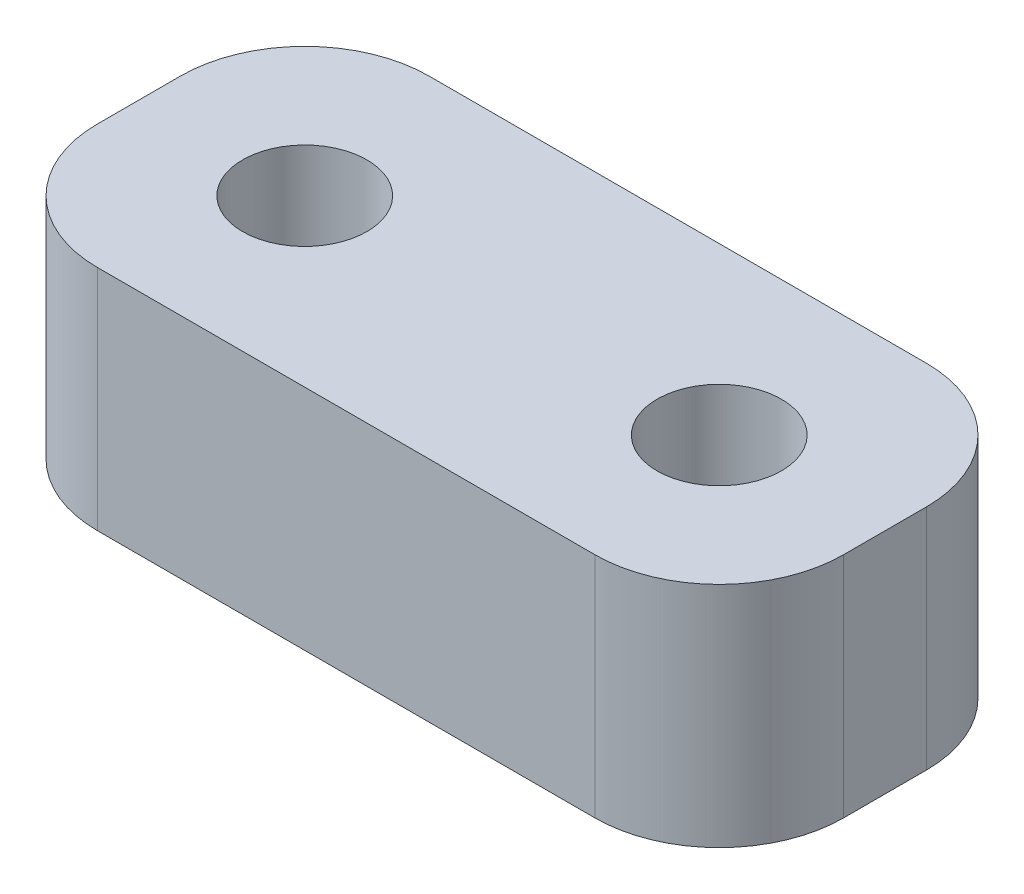
ISO-10303-21;
HEADER;
FILE_DESCRIPTION(('STEP AP214'),'2;1');
FILE_NAME('part.step','',(''),(''),'','','');
FILE_SCHEMA(('AUTOMOTIVE_DESIGN { 1 0 10303 214 1 1 1 1 }'));
ENDSEC;
DATA;
#1=APPLICATION_CONTEXT('core data for automotive mechanical design processes');
#2=APPLICATION_PROTOCOL_DEFINITION('international standard','automotive_design',2000,#1);
#3=PRODUCT_CONTEXT('',#1,'mechanical');
#4=PRODUCT('Part','Part','',(#3));
#5=PRODUCT_RELATED_PRODUCT_CATEGORY('part','',(#4));
#6=PRODUCT_DEFINITION_FORMATION('','',#4);
#7=PRODUCT_DEFINITION_CONTEXT('part definition',#1,'design');
#8=PRODUCT_DEFINITION('design','',#6,#7);
#9=PRODUCT_DEFINITION_SHAPE('','',#8);
#10=(LENGTH_UNIT() NAMED_UNIT(*) SI_UNIT(.MILLI.,.METRE.));
#11=(NAMED_UNIT(*) PLANE_ANGLE_UNIT() SI_UNIT($,.RADIAN.));
#12=(NAMED_UNIT(*) SI_UNIT($,.STERADIAN.) SOLID_ANGLE_UNIT());
#13=UNCERTAINTY_MEASURE_WITH_UNIT(LENGTH_MEASURE(1.E-05),#10,'distance_accuracy_value','');
#14=(GEOMETRIC_REPRESENTATION_CONTEXT(3) GLOBAL_UNCERTAINTY_ASSIGNED_CONTEXT((#13)) GLOBAL_UNIT_ASSIGNED_CONTEXT((#10,
#11,#12)) REPRESENTATION_CONTEXT('',''));
#15=CARTESIAN_POINT('',(0.,0.,0.));
#16=DIRECTION('',(0.,0.,1.));
#17=DIRECTION('',(1.,0.,0.));
#18=AXIS2_PLACEMENT_3D('',#15,#16,#17);
#19=CARTESIAN_POINT('',(0.,5.5,0.));
#20=DIRECTION('',(0.,-1.,0.));
#21=DIRECTION('',(0.,0.,-1.));
#22=AXIS2_PLACEMENT_3D('',#19,#20,#21);
#23=PLANE('',#22);
#24=CARTESIAN_POINT('',(4.,5.5,-4.));
#25=DIRECTION('',(0.,1.,0.));
#26=DIRECTION('',(0.,0.,1.));
#27=AXIS2_PLACEMENT_3D('',#24,#25,#26);
#28=CIRCLE('',#27,1.5);
#29=CARTESIAN_POINT('',(4.,5.5,-2.5));
#30=VERTEX_POINT('',#29);
#31=EDGE_CURVE('E126',#30,#30,#28,.T.);
#32=ORIENTED_EDGE('',*,*,#31,.F.);
#33=EDGE_LOOP('',(#32));
#34=FACE_BOUND('',#33,.T.);
#35=DIRECTION('',(-1.,0.,0.));
#36=VECTOR('',#35,1.);
#37=CARTESIAN_POINT('',(0.,5.5,-8.));
#38=LINE('',#37,#36);
#39=CARTESIAN_POINT('',(15.,5.5,-8.));
#40=VERTEX_POINT('',#39);
#41=CARTESIAN_POINT('',(3.,5.5,-8.));
#42=VERTEX_POINT('',#41);
#43=EDGE_CURVE('E135',#40,#42,#38,.T.);
#44=ORIENTED_EDGE('',*,*,#43,.T.);
#45=CARTESIAN_POINT('',(3.,5.5,-5.));
#46=DIRECTION('',(0.,-1.,0.));
#47=DIRECTION('',(0.,0.,-1.));
#48=AXIS2_PLACEMENT_3D('',#45,#46,#47);
#49=CIRCLE('',#48,3.);
#50=CARTESIAN_POINT('',(0.,5.5,-5.));
#51=VERTEX_POINT('',#50);
#52=EDGE_CURVE('E154',#42,#51,#49,.F.);
#53=ORIENTED_EDGE('',*,*,#52,.T.);
#54=DIRECTION('',(0.,0.,1.));
#55=VECTOR('',#54,1.);
#56=CARTESIAN_POINT('',(0.,5.5,0.));
#57=LINE('',#56,#55);
#58=CARTESIAN_POINT('',(0.,5.5,-3.));
#59=VERTEX_POINT('',#58);
#60=EDGE_CURVE('E118',#51,#59,#57,.T.);
#61=ORIENTED_EDGE('',*,*,#60,.T.);
#62=CARTESIAN_POINT('',(3.,5.5,-3.));
#63=DIRECTION('',(0.,-1.,0.));
#64=DIRECTION('',(0.,0.,-1.));
#65=AXIS2_PLACEMENT_3D('',#62,#63,#64);
#66=CIRCLE('',#65,3.);
#67=CARTESIAN_POINT('',(3.,5.5,0.));
#68=VERTEX_POINT('',#67);
#69=EDGE_CURVE('E152',#59,#68,#66,.F.);
#70=ORIENTED_EDGE('',*,*,#69,.T.);
#71=DIRECTION('',(1.,0.,0.));
#72=VECTOR('',#71,1.);
#73=CARTESIAN_POINT('',(0.,5.5,0.));
#74=LINE('',#73,#72);
#75=CARTESIAN_POINT('',(15.,5.5,0.));
#76=VERTEX_POINT('',#75);
#77=EDGE_CURVE('E174',#68,#76,#74,.T.);
#78=ORIENTED_EDGE('',*,*,#77,.T.);
#79=CARTESIAN_POINT('',(15.,5.5,-3.));
#80=DIRECTION('',(0.,-1.,0.));
#81=DIRECTION('',(0.,0.,-1.));
#82=AXIS2_PLACEMENT_3D('',#79,#80,#81);
#83=CIRCLE('',#82,3.);
#84=CARTESIAN_POINT('',(18.,5.5,-3.));
#85=VERTEX_POINT('',#84);
#86=EDGE_CURVE('E53',#76,#85,#83,.F.);
#87=ORIENTED_EDGE('',*,*,#86,.T.);
#88=DIRECTION('',(0.,0.,-1.));
#89=VECTOR('',#88,1.);
#90=CARTESIAN_POINT('',(18.,5.5,0.));
#91=LINE('',#90,#89);
#92=CARTESIAN_POINT('',(18.,5.5,-5.));
#93=VERTEX_POINT('',#92);
#94=EDGE_CURVE('E164',#85,#93,#91,.T.);
#95=ORIENTED_EDGE('',*,*,#94,.T.);
#96=CARTESIAN_POINT('',(15.,5.5,-5.));
#97=DIRECTION('',(0.,-1.,0.));
#98=DIRECTION('',(0.,0.,-1.));
#99=AXIS2_PLACEMENT_3D('',#96,#97,#98);
#100=CIRCLE('',#99,3.);
#101=EDGE_CURVE('E150',#93,#40,#100,.F.);
#102=ORIENTED_EDGE('',*,*,#101,.T.);
#103=EDGE_LOOP('',(#44,#53,#61,#70,#78,#87,#95,#102));
#104=FACE_BOUND('',#103,.T.);
#105=CARTESIAN_POINT('',(14.,5.5,-4.));
#106=DIRECTION('',(0.,1.,0.));
#107=DIRECTION('',(0.,0.,1.));
#108=AXIS2_PLACEMENT_3D('',#105,#106,#107);
#109=CIRCLE('',#108,1.5);
#110=CARTESIAN_POINT('',(14.,5.5,-2.5));
#111=VERTEX_POINT('',#110);
#112=EDGE_CURVE('E179',#111,#111,#109,.T.);
#113=ORIENTED_EDGE('',*,*,#112,.F.);
#114=EDGE_LOOP('',(#113));
#115=FACE_BOUND('',#114,.T.);
#116=ADVANCED_FACE('F33',(#34,#104,#115),#23,.F.);
#117=CARTESIAN_POINT('',(0.,0.,0.));
#118=DIRECTION('',(0.,-1.,0.));
#119=DIRECTION('',(0.,0.,-1.));
#120=AXIS2_PLACEMENT_3D('',#117,#118,#119);
#121=PLANE('',#120);
#122=CARTESIAN_POINT('',(4.,0.,-4.));
#123=DIRECTION('',(0.,1.,0.));
#124=DIRECTION('',(0.,0.,1.));
#125=AXIS2_PLACEMENT_3D('',#122,#123,#124);
#126=CIRCLE('',#125,1.5);
#127=CARTESIAN_POINT('',(4.,0.,-2.5));
#128=VERTEX_POINT('',#127);
#129=EDGE_CURVE('E132',#128,#128,#126,.T.);
#130=ORIENTED_EDGE('',*,*,#129,.T.);
#131=EDGE_LOOP('',(#130));
#132=FACE_BOUND('',#131,.T.);
#133=DIRECTION('',(0.,0.,1.));
#134=VECTOR('',#133,1.);
#135=CARTESIAN_POINT('',(0.,0.,0.));
#136=LINE('',#135,#134);
#137=CARTESIAN_POINT('',(0.,0.,-5.));
#138=VERTEX_POINT('',#137);
#139=CARTESIAN_POINT('',(0.,0.,-3.));
#140=VERTEX_POINT('',#139);
#141=EDGE_CURVE('E115',#138,#140,#136,.T.);
#142=ORIENTED_EDGE('',*,*,#141,.F.);
#143=CARTESIAN_POINT('',(3.,0.,-5.));
#144=DIRECTION('',(0.,-1.,0.));
#145=DIRECTION('',(0.,0.,-1.));
#146=AXIS2_PLACEMENT_3D('',#143,#144,#145);
#147=CIRCLE('',#146,3.);
#148=CARTESIAN_POINT('',(3.,0.,-8.));
#149=VERTEX_POINT('',#148);
#150=EDGE_CURVE('E98',#138,#149,#147,.T.);
#151=ORIENTED_EDGE('',*,*,#150,.T.);
#152=DIRECTION('',(-1.,0.,0.));
#153=VECTOR('',#152,1.);
#154=CARTESIAN_POINT('',(0.,0.,-8.));
#155=LINE('',#154,#153);
#156=CARTESIAN_POINT('',(15.,0.,-8.));
#157=VERTEX_POINT('',#156);
#158=EDGE_CURVE('E139',#157,#149,#155,.T.);
#159=ORIENTED_EDGE('',*,*,#158,.F.);
#160=CARTESIAN_POINT('',(15.,0.,-5.));
#161=DIRECTION('',(0.,-1.,0.));
#162=DIRECTION('',(0.,0.,-1.));
#163=AXIS2_PLACEMENT_3D('',#160,#161,#162);
#164=CIRCLE('',#163,3.);
#165=CARTESIAN_POINT('',(18.,0.,-5.));
#166=VERTEX_POINT('',#165);
#167=EDGE_CURVE('E143',#157,#166,#164,.T.);
#168=ORIENTED_EDGE('',*,*,#167,.T.);
#169=DIRECTION('',(0.,0.,-1.));
#170=VECTOR('',#169,1.);
#171=CARTESIAN_POINT('',(18.,0.,0.));
#172=LINE('',#171,#170);
#173=CARTESIAN_POINT('',(18.,0.,-3.));
#174=VERTEX_POINT('',#173);
#175=EDGE_CURVE('E129',#174,#166,#172,.T.);
#176=ORIENTED_EDGE('',*,*,#175,.F.);
#177=CARTESIAN_POINT('',(15.,0.,-3.));
#178=DIRECTION('',(0.,-1.,0.));
#179=DIRECTION('',(0.,0.,-1.));
#180=AXIS2_PLACEMENT_3D('',#177,#178,#179);
#181=CIRCLE('',#180,3.);
#182=CARTESIAN_POINT('',(15.,0.,0.));
#183=VERTEX_POINT('',#182);
#184=EDGE_CURVE('E119',#174,#183,#181,.T.);
#185=ORIENTED_EDGE('',*,*,#184,.T.);
#186=DIRECTION('',(1.,0.,0.));
#187=VECTOR('',#186,1.);
#188=CARTESIAN_POINT('',(0.,0.,0.));
#189=LINE('',#188,#187);
#190=CARTESIAN_POINT('',(3.,0.,0.));
#191=VERTEX_POINT('',#190);
#192=EDGE_CURVE('E125',#191,#183,#189,.T.);
#193=ORIENTED_EDGE('',*,*,#192,.F.);
#194=CARTESIAN_POINT('',(3.,0.,-3.));
#195=DIRECTION('',(0.,-1.,0.));
#196=DIRECTION('',(0.,0.,-1.));
#197=AXIS2_PLACEMENT_3D('',#194,#195,#196);
#198=CIRCLE('',#197,3.);
#199=EDGE_CURVE('E109',#191,#140,#198,.T.);
#200=ORIENTED_EDGE('',*,*,#199,.T.);
#201=EDGE_LOOP('',(#142,#151,#159,#168,#176,#185,#193,#200));
#202=FACE_BOUND('',#201,.T.);
#203=CARTESIAN_POINT('',(14.,0.,-4.));
#204=DIRECTION('',(0.,1.,0.));
#205=DIRECTION('',(0.,0.,1.));
#206=AXIS2_PLACEMENT_3D('',#203,#204,#205);
#207=CIRCLE('',#206,1.5);
#208=CARTESIAN_POINT('',(14.,0.,-2.5));
#209=VERTEX_POINT('',#208);
#210=EDGE_CURVE('E181',#209,#209,#207,.T.);
#211=ORIENTED_EDGE('',*,*,#210,.T.);
#212=EDGE_LOOP('',(#211));
#213=FACE_BOUND('',#212,.T.);
#214=ADVANCED_FACE('F122',(#132,#202,#213),#121,.T.);
#215=CARTESIAN_POINT('',(0.,5.5,0.));
#216=DIRECTION('',(1.,0.,0.));
#217=DIRECTION('',(0.,0.,-1.));
#218=AXIS2_PLACEMENT_3D('',#215,#216,#217);
#219=PLANE('',#218);
#220=ORIENTED_EDGE('',*,*,#60,.F.);
#221=DIRECTION('',(0.,-1.,0.));
#222=VECTOR('',#221,1.);
#223=CARTESIAN_POINT('',(0.,5.5,-5.));
#224=LINE('',#223,#222);
#225=EDGE_CURVE('E102',#51,#138,#224,.T.);
#226=ORIENTED_EDGE('',*,*,#225,.T.);
#227=ORIENTED_EDGE('',*,*,#141,.T.);
#228=DIRECTION('',(0.,-1.,0.));
#229=VECTOR('',#228,1.);
#230=CARTESIAN_POINT('',(0.,5.5,-3.));
#231=LINE('',#230,#229);
#232=EDGE_CURVE('E120',#140,#59,#231,.F.);
#233=ORIENTED_EDGE('',*,*,#232,.T.);
#234=EDGE_LOOP('',(#220,#226,#227,#233));
#235=FACE_BOUND('',#234,.T.);
#236=ADVANCED_FACE('F114',(#235),#219,.F.);
#237=CARTESIAN_POINT('',(0.,5.5,0.));
#238=DIRECTION('',(0.,0.,-1.));
#239=DIRECTION('',(-1.,0.,0.));
#240=AXIS2_PLACEMENT_3D('',#237,#238,#239);
#241=PLANE('',#240);
#242=ORIENTED_EDGE('',*,*,#77,.F.);
#243=DIRECTION('',(0.,-1.,0.));
#244=VECTOR('',#243,1.);
#245=CARTESIAN_POINT('',(3.,5.5,0.));
#246=LINE('',#245,#244);
#247=EDGE_CURVE('E158',#68,#191,#246,.T.);
#248=ORIENTED_EDGE('',*,*,#247,.T.);
#249=ORIENTED_EDGE('',*,*,#192,.T.);
#250=DIRECTION('',(0.,-1.,0.));
#251=VECTOR('',#250,1.);
#252=CARTESIAN_POINT('',(15.,5.5,0.));
#253=LINE('',#252,#251);
#254=EDGE_CURVE('E156',#183,#76,#253,.F.);
#255=ORIENTED_EDGE('',*,*,#254,.T.);
#256=EDGE_LOOP('',(#242,#248,#249,#255));
#257=FACE_BOUND('',#256,.T.);
#258=ADVANCED_FACE('F207',(#257),#241,.F.);
#259=CARTESIAN_POINT('',(18.,5.5,0.));
#260=DIRECTION('',(-1.,0.,0.));
#261=DIRECTION('',(0.,0.,1.));
#262=AXIS2_PLACEMENT_3D('',#259,#260,#261);
#263=PLANE('',#262);
#264=ORIENTED_EDGE('',*,*,#175,.T.);
#265=DIRECTION('',(0.,-1.,0.));
#266=VECTOR('',#265,1.);
#267=CARTESIAN_POINT('',(18.,5.5,-5.));
#268=LINE('',#267,#266);
#269=EDGE_CURVE('E11',#166,#93,#268,.F.);
#270=ORIENTED_EDGE('',*,*,#269,.T.);
#271=ORIENTED_EDGE('',*,*,#94,.F.);
#272=DIRECTION('',(0.,-1.,0.));
#273=VECTOR('',#272,1.);
#274=CARTESIAN_POINT('',(18.,5.5,-3.));
#275=LINE('',#274,#273);
#276=EDGE_CURVE('E41',#85,#174,#275,.T.);
#277=ORIENTED_EDGE('',*,*,#276,.T.);
#278=EDGE_LOOP('',(#264,#270,#271,#277));
#279=FACE_BOUND('',#278,.T.);
#280=ADVANCED_FACE('F163',(#279),#263,.F.);
#281=CARTESIAN_POINT('',(0.,5.5,-8.));
#282=DIRECTION('',(0.,0.,1.));
#283=DIRECTION('',(1.,0.,0.));
#284=AXIS2_PLACEMENT_3D('',#281,#282,#283);
#285=PLANE('',#284);
#286=ORIENTED_EDGE('',*,*,#158,.T.);
#287=DIRECTION('',(0.,-1.,0.));
#288=VECTOR('',#287,1.);
#289=CARTESIAN_POINT('',(3.,5.5,-8.));
#290=LINE('',#289,#288);
#291=EDGE_CURVE('E103',#149,#42,#290,.F.);
#292=ORIENTED_EDGE('',*,*,#291,.T.);
#293=ORIENTED_EDGE('',*,*,#43,.F.);
#294=DIRECTION('',(0.,-1.,0.));
#295=VECTOR('',#294,1.);
#296=CARTESIAN_POINT('',(15.,5.5,-8.));
#297=LINE('',#296,#295);
#298=EDGE_CURVE('E108',#40,#157,#297,.T.);
#299=ORIENTED_EDGE('',*,*,#298,.T.);
#300=EDGE_LOOP('',(#286,#292,#293,#299));
#301=FACE_BOUND('',#300,.T.);
#302=ADVANCED_FACE('F172',(#301),#285,.F.);
#303=CARTESIAN_POINT('',(4.,5.5,-4.));
#304=DIRECTION('',(0.,-1.,0.));
#305=DIRECTION('',(0.,0.,-1.));
#306=AXIS2_PLACEMENT_3D('',#303,#304,#305);
#307=CYLINDRICAL_SURFACE('',#306,1.5);
#308=ORIENTED_EDGE('',*,*,#31,.T.);
#309=EDGE_LOOP('',(#308));
#310=FACE_BOUND('',#309,.T.);
#311=ORIENTED_EDGE('',*,*,#129,.F.);
#312=EDGE_LOOP('',(#311));
#313=FACE_BOUND('',#312,.T.);
#314=ADVANCED_FACE('F200',(#310,#313),#307,.F.);
#315=CARTESIAN_POINT('',(14.,5.5,-4.));
#316=DIRECTION('',(0.,-1.,0.));
#317=DIRECTION('',(0.,0.,-1.));
#318=AXIS2_PLACEMENT_3D('',#315,#316,#317);
#319=CYLINDRICAL_SURFACE('',#318,1.5);
#320=ORIENTED_EDGE('',*,*,#112,.T.);
#321=EDGE_LOOP('',(#320));
#322=FACE_BOUND('',#321,.T.);
#323=ORIENTED_EDGE('',*,*,#210,.F.);
#324=EDGE_LOOP('',(#323));
#325=FACE_BOUND('',#324,.T.);
#326=ADVANCED_FACE('F187',(#322,#325),#319,.F.);
#327=CARTESIAN_POINT('',(3.,5.5,-5.));
#328=DIRECTION('',(0.,-1.,0.));
#329=DIRECTION('',(0.,0.,-1.));
#330=AXIS2_PLACEMENT_3D('',#327,#328,#329);
#331=CYLINDRICAL_SURFACE('',#330,3.);
#332=ORIENTED_EDGE('',*,*,#52,.F.);
#333=ORIENTED_EDGE('',*,*,#291,.F.);
#334=ORIENTED_EDGE('',*,*,#150,.F.);
#335=ORIENTED_EDGE('',*,*,#225,.F.);
#336=EDGE_LOOP('',(#332,#333,#334,#335));
#337=FACE_BOUND('',#336,.T.);
#338=ADVANCED_FACE('F101',(#337),#331,.T.);
#339=CARTESIAN_POINT('',(3.,5.5,-3.));
#340=DIRECTION('',(0.,-1.,0.));
#341=DIRECTION('',(0.,0.,-1.));
#342=AXIS2_PLACEMENT_3D('',#339,#340,#341);
#343=CYLINDRICAL_SURFACE('',#342,3.);
#344=ORIENTED_EDGE('',*,*,#69,.F.);
#345=ORIENTED_EDGE('',*,*,#232,.F.);
#346=ORIENTED_EDGE('',*,*,#199,.F.);
#347=ORIENTED_EDGE('',*,*,#247,.F.);
#348=EDGE_LOOP('',(#344,#345,#346,#347));
#349=FACE_BOUND('',#348,.T.);
#350=ADVANCED_FACE('F215',(#349),#343,.T.);
#351=CARTESIAN_POINT('',(15.,5.5,-5.));
#352=DIRECTION('',(0.,-1.,0.));
#353=DIRECTION('',(0.,0.,-1.));
#354=AXIS2_PLACEMENT_3D('',#351,#352,#353);
#355=CYLINDRICAL_SURFACE('',#354,3.);
#356=ORIENTED_EDGE('',*,*,#101,.F.);
#357=ORIENTED_EDGE('',*,*,#269,.F.);
#358=ORIENTED_EDGE('',*,*,#167,.F.);
#359=ORIENTED_EDGE('',*,*,#298,.F.);
#360=EDGE_LOOP('',(#356,#357,#358,#359));
#361=FACE_BOUND('',#360,.T.);
#362=ADVANCED_FACE('F169',(#361),#355,.T.);
#363=CARTESIAN_POINT('',(15.,5.5,-3.));
#364=DIRECTION('',(0.,-1.,0.));
#365=DIRECTION('',(0.,0.,-1.));
#366=AXIS2_PLACEMENT_3D('',#363,#364,#365);
#367=CYLINDRICAL_SURFACE('',#366,3.);
#368=ORIENTED_EDGE('',*,*,#86,.F.);
#369=ORIENTED_EDGE('',*,*,#254,.F.);
#370=ORIENTED_EDGE('',*,*,#184,.F.);
#371=ORIENTED_EDGE('',*,*,#276,.F.);
#372=EDGE_LOOP('',(#368,#369,#370,#371));
#373=FACE_BOUND('',#372,.T.);
#374=ADVANCED_FACE('F35',(#373),#367,.T.);
#375=CLOSED_SHELL('',(#116,#214,#236,#258,#280,#302,#314,#326,#338,#350,#362,#374));
#376=MANIFOLD_SOLID_BREP('B2',#375);
#377=ADVANCED_BREP_SHAPE_REPRESENTATION('',(#18,#376),#14);
#378=SHAPE_DEFINITION_REPRESENTATION(#9,#377);
ENDSEC;
END-ISO-10303-21;
